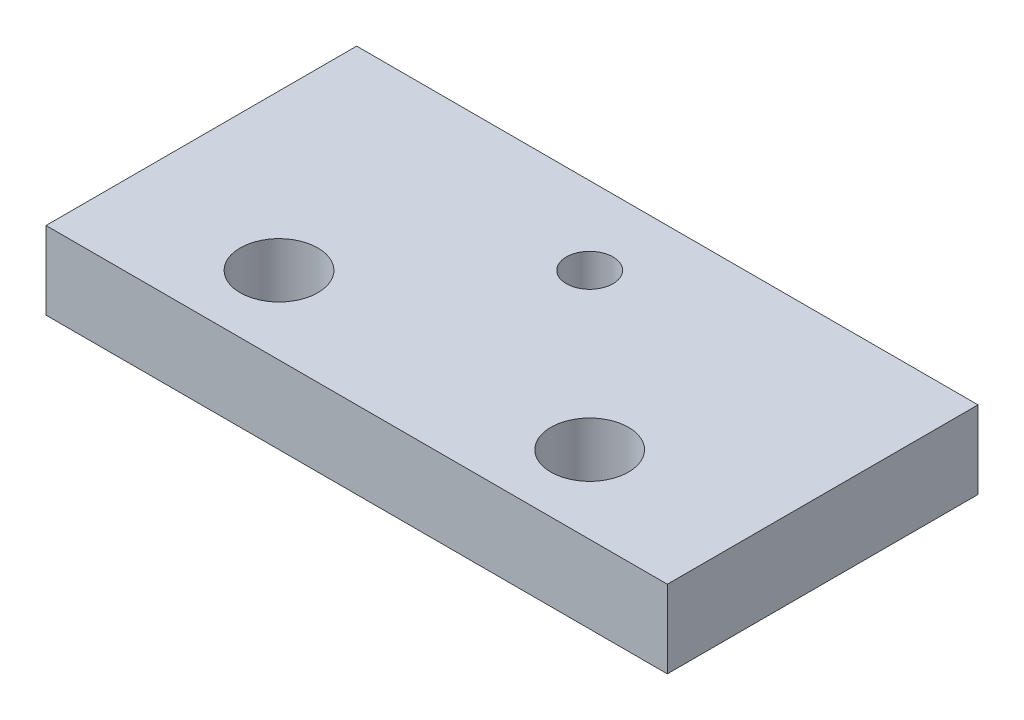
ISO-10303-21;
HEADER;
FILE_DESCRIPTION(('STEP AP214'),'2;1');
FILE_NAME('part.step','',(''),(''),'','','');
FILE_SCHEMA(('AUTOMOTIVE_DESIGN { 1 0 10303 214 1 1 1 1 }'));
ENDSEC;
DATA;
#1=APPLICATION_CONTEXT('core data for automotive mechanical design processes');
#2=APPLICATION_PROTOCOL_DEFINITION('international standard','automotive_design',2000,#1);
#3=PRODUCT_CONTEXT('',#1,'mechanical');
#4=PRODUCT('Part','Part','',(#3));
#5=PRODUCT_RELATED_PRODUCT_CATEGORY('part','',(#4));
#6=PRODUCT_DEFINITION_FORMATION('','',#4);
#7=PRODUCT_DEFINITION_CONTEXT('part definition',#1,'design');
#8=PRODUCT_DEFINITION('design','',#6,#7);
#9=PRODUCT_DEFINITION_SHAPE('','',#8);
#10=(LENGTH_UNIT() NAMED_UNIT(*) SI_UNIT(.MILLI.,.METRE.));
#11=(NAMED_UNIT(*) PLANE_ANGLE_UNIT() SI_UNIT($,.RADIAN.));
#12=(NAMED_UNIT(*) SI_UNIT($,.STERADIAN.) SOLID_ANGLE_UNIT());
#13=UNCERTAINTY_MEASURE_WITH_UNIT(LENGTH_MEASURE(1.E-05),#10,'distance_accuracy_value','');
#14=(GEOMETRIC_REPRESENTATION_CONTEXT(3) GLOBAL_UNCERTAINTY_ASSIGNED_CONTEXT((#13)) GLOBAL_UNIT_ASSIGNED_CONTEXT((#10,
#11,#12)) REPRESENTATION_CONTEXT('',''));
#15=CARTESIAN_POINT('',(0.,0.,0.));
#16=DIRECTION('',(0.,0.,1.));
#17=DIRECTION('',(1.,0.,0.));
#18=AXIS2_PLACEMENT_3D('',#15,#16,#17);
#19=CARTESIAN_POINT('',(0.,3.175,0.));
#20=DIRECTION('',(1.,0.,0.));
#21=DIRECTION('',(0.,0.,-1.));
#22=AXIS2_PLACEMENT_3D('',#19,#20,#21);
#23=PLANE('',#22);
#24=DIRECTION('',(0.,0.,1.));
#25=VECTOR('',#24,1.);
#26=CARTESIAN_POINT('',(0.,0.,0.));
#27=LINE('',#26,#25);
#28=CARTESIAN_POINT('',(0.,0.,-12.7));
#29=VERTEX_POINT('',#28);
#30=CARTESIAN_POINT('',(0.,0.,0.));
#31=VERTEX_POINT('',#30);
#32=EDGE_CURVE('E96',#29,#31,#27,.T.);
#33=ORIENTED_EDGE('',*,*,#32,.T.);
#34=DIRECTION('',(0.,-1.,0.));
#35=VECTOR('',#34,1.);
#36=CARTESIAN_POINT('',(0.,3.175,0.));
#37=LINE('',#36,#35);
#38=CARTESIAN_POINT('',(0.,3.175,0.));
#39=VERTEX_POINT('',#38);
#40=EDGE_CURVE('E11',#39,#31,#37,.T.);
#41=ORIENTED_EDGE('',*,*,#40,.F.);
#42=DIRECTION('',(0.,0.,1.));
#43=VECTOR('',#42,1.);
#44=CARTESIAN_POINT('',(0.,3.175,0.));
#45=LINE('',#44,#43);
#46=CARTESIAN_POINT('',(0.,3.175,-12.7));
#47=VERTEX_POINT('',#46);
#48=EDGE_CURVE('E84',#47,#39,#45,.T.);
#49=ORIENTED_EDGE('',*,*,#48,.F.);
#50=DIRECTION('',(0.,-1.,0.));
#51=VECTOR('',#50,1.);
#52=CARTESIAN_POINT('',(0.,3.175,-12.7));
#53=LINE('',#52,#51);
#54=EDGE_CURVE('E92',#47,#29,#53,.T.);
#55=ORIENTED_EDGE('',*,*,#54,.T.);
#56=EDGE_LOOP('',(#33,#41,#49,#55));
#57=FACE_BOUND('',#56,.T.);
#58=ADVANCED_FACE('F33',(#57),#23,.F.);
#59=CARTESIAN_POINT('',(0.,3.175,0.));
#60=DIRECTION('',(0.,0.,-1.));
#61=DIRECTION('',(-1.,0.,0.));
#62=AXIS2_PLACEMENT_3D('',#59,#60,#61);
#63=PLANE('',#62);
#64=DIRECTION('',(1.,0.,0.));
#65=VECTOR('',#64,1.);
#66=CARTESIAN_POINT('',(0.,0.,0.));
#67=LINE('',#66,#65);
#68=CARTESIAN_POINT('',(25.4,0.,0.));
#69=VERTEX_POINT('',#68);
#70=EDGE_CURVE('E88',#31,#69,#67,.T.);
#71=ORIENTED_EDGE('',*,*,#70,.T.);
#72=DIRECTION('',(0.,-1.,0.));
#73=VECTOR('',#72,1.);
#74=CARTESIAN_POINT('',(25.4,3.175,0.));
#75=LINE('',#74,#73);
#76=CARTESIAN_POINT('',(25.4,3.175,0.));
#77=VERTEX_POINT('',#76);
#78=EDGE_CURVE('E41',#77,#69,#75,.T.);
#79=ORIENTED_EDGE('',*,*,#78,.F.);
#80=DIRECTION('',(1.,0.,0.));
#81=VECTOR('',#80,1.);
#82=CARTESIAN_POINT('',(0.,3.175,0.));
#83=LINE('',#82,#81);
#84=EDGE_CURVE('E79',#39,#77,#83,.T.);
#85=ORIENTED_EDGE('',*,*,#84,.F.);
#86=ORIENTED_EDGE('',*,*,#40,.T.);
#87=EDGE_LOOP('',(#71,#79,#85,#86));
#88=FACE_BOUND('',#87,.T.);
#89=ADVANCED_FACE('F87',(#88),#63,.F.);
#90=CARTESIAN_POINT('',(25.4,3.175,0.));
#91=DIRECTION('',(-1.,0.,0.));
#92=DIRECTION('',(0.,0.,1.));
#93=AXIS2_PLACEMENT_3D('',#90,#91,#92);
#94=PLANE('',#93);
#95=DIRECTION('',(0.,0.,-1.));
#96=VECTOR('',#95,1.);
#97=CARTESIAN_POINT('',(25.4,0.,0.));
#98=LINE('',#97,#96);
#99=CARTESIAN_POINT('',(25.4,0.,-12.7));
#100=VERTEX_POINT('',#99);
#101=EDGE_CURVE('E66',#69,#100,#98,.T.);
#102=ORIENTED_EDGE('',*,*,#101,.T.);
#103=DIRECTION('',(0.,-1.,0.));
#104=VECTOR('',#103,1.);
#105=CARTESIAN_POINT('',(25.4,3.175,-12.7));
#106=LINE('',#105,#104);
#107=CARTESIAN_POINT('',(25.4,3.175,-12.7));
#108=VERTEX_POINT('',#107);
#109=EDGE_CURVE('E89',#108,#100,#106,.T.);
#110=ORIENTED_EDGE('',*,*,#109,.F.);
#111=DIRECTION('',(0.,0.,-1.));
#112=VECTOR('',#111,1.);
#113=CARTESIAN_POINT('',(25.4,3.175,0.));
#114=LINE('',#113,#112);
#115=EDGE_CURVE('E82',#77,#108,#114,.T.);
#116=ORIENTED_EDGE('',*,*,#115,.F.);
#117=ORIENTED_EDGE('',*,*,#78,.T.);
#118=EDGE_LOOP('',(#102,#110,#116,#117));
#119=FACE_BOUND('',#118,.T.);
#120=ADVANCED_FACE('F90',(#119),#94,.F.);
#121=CARTESIAN_POINT('',(0.,3.175,-12.7));
#122=DIRECTION('',(0.,0.,1.));
#123=DIRECTION('',(1.,0.,0.));
#124=AXIS2_PLACEMENT_3D('',#121,#122,#123);
#125=PLANE('',#124);
#126=DIRECTION('',(-1.,0.,0.));
#127=VECTOR('',#126,1.);
#128=CARTESIAN_POINT('',(0.,0.,-12.7));
#129=LINE('',#128,#127);
#130=EDGE_CURVE('E72',#100,#29,#129,.T.);
#131=ORIENTED_EDGE('',*,*,#130,.T.);
#132=ORIENTED_EDGE('',*,*,#54,.F.);
#133=DIRECTION('',(-1.,0.,0.));
#134=VECTOR('',#133,1.);
#135=CARTESIAN_POINT('',(0.,3.175,-12.7));
#136=LINE('',#135,#134);
#137=EDGE_CURVE('E49',#108,#47,#136,.T.);
#138=ORIENTED_EDGE('',*,*,#137,.F.);
#139=ORIENTED_EDGE('',*,*,#109,.T.);
#140=EDGE_LOOP('',(#131,#132,#138,#139));
#141=FACE_BOUND('',#140,.T.);
#142=ADVANCED_FACE('F104',(#141),#125,.F.);
#143=CARTESIAN_POINT('',(0.,3.175,0.));
#144=DIRECTION('',(0.,-1.,0.));
#145=DIRECTION('',(0.,0.,-1.));
#146=AXIS2_PLACEMENT_3D('',#143,#144,#145);
#147=PLANE('',#146);
#148=CARTESIAN_POINT('',(12.7,3.175,-9.525));
#149=DIRECTION('',(0.,1.,0.));
#150=DIRECTION('',(0.,0.,1.));
#151=AXIS2_PLACEMENT_3D('',#148,#149,#150);
#152=CIRCLE('',#151,0.9525);
#153=CARTESIAN_POINT('',(12.7,3.175,-8.5725));
#154=VERTEX_POINT('',#153);
#155=EDGE_CURVE('E122',#154,#154,#152,.T.);
#156=ORIENTED_EDGE('',*,*,#155,.F.);
#157=EDGE_LOOP('',(#156));
#158=FACE_BOUND('',#157,.T.);
#159=CARTESIAN_POINT('',(6.35,3.175,-3.175));
#160=DIRECTION('',(0.,1.,0.));
#161=DIRECTION('',(0.,0.,-1.));
#162=AXIS2_PLACEMENT_3D('',#159,#160,#161);
#163=CIRCLE('',#162,1.5875);
#164=CARTESIAN_POINT('',(6.35,3.175,-4.7625));
#165=VERTEX_POINT('',#164);
#166=EDGE_CURVE('E116',#165,#165,#163,.T.);
#167=ORIENTED_EDGE('',*,*,#166,.F.);
#168=EDGE_LOOP('',(#167));
#169=FACE_BOUND('',#168,.T.);
#170=CARTESIAN_POINT('',(19.05,3.175,-3.175));
#171=DIRECTION('',(0.,1.,0.));
#172=DIRECTION('',(0.,0.,1.));
#173=AXIS2_PLACEMENT_3D('',#170,#171,#172);
#174=CIRCLE('',#173,1.5875);
#175=CARTESIAN_POINT('',(19.05,3.175,-1.5875));
#176=VERTEX_POINT('',#175);
#177=EDGE_CURVE('E110',#176,#176,#174,.T.);
#178=ORIENTED_EDGE('',*,*,#177,.F.);
#179=EDGE_LOOP('',(#178));
#180=FACE_BOUND('',#179,.T.);
#181=ORIENTED_EDGE('',*,*,#48,.T.);
#182=ORIENTED_EDGE('',*,*,#84,.T.);
#183=ORIENTED_EDGE('',*,*,#115,.T.);
#184=ORIENTED_EDGE('',*,*,#137,.T.);
#185=EDGE_LOOP('',(#181,#182,#183,#184));
#186=FACE_BOUND('',#185,.T.);
#187=ADVANCED_FACE('F80',(#158,#169,#180,#186),#147,.F.);
#188=CARTESIAN_POINT('',(0.,0.,0.));
#189=DIRECTION('',(0.,-1.,0.));
#190=DIRECTION('',(0.,0.,-1.));
#191=AXIS2_PLACEMENT_3D('',#188,#189,#190);
#192=PLANE('',#191);
#193=CARTESIAN_POINT('',(12.7,0.,-9.525));
#194=DIRECTION('',(0.,1.,0.));
#195=DIRECTION('',(0.,0.,1.));
#196=AXIS2_PLACEMENT_3D('',#193,#194,#195);
#197=CIRCLE('',#196,0.9525);
#198=CARTESIAN_POINT('',(12.7,0.,-8.5725));
#199=VERTEX_POINT('',#198);
#200=EDGE_CURVE('E119',#199,#199,#197,.T.);
#201=ORIENTED_EDGE('',*,*,#200,.T.);
#202=EDGE_LOOP('',(#201));
#203=FACE_BOUND('',#202,.T.);
#204=CARTESIAN_POINT('',(6.35,0.,-3.175));
#205=DIRECTION('',(0.,1.,0.));
#206=DIRECTION('',(0.,0.,-1.));
#207=AXIS2_PLACEMENT_3D('',#204,#205,#206);
#208=CIRCLE('',#207,1.5875);
#209=CARTESIAN_POINT('',(6.35,0.,-4.7625));
#210=VERTEX_POINT('',#209);
#211=EDGE_CURVE('E113',#210,#210,#208,.T.);
#212=ORIENTED_EDGE('',*,*,#211,.T.);
#213=EDGE_LOOP('',(#212));
#214=FACE_BOUND('',#213,.T.);
#215=CARTESIAN_POINT('',(19.05,0.,-3.175));
#216=DIRECTION('',(0.,1.,0.));
#217=DIRECTION('',(0.,0.,1.));
#218=AXIS2_PLACEMENT_3D('',#215,#216,#217);
#219=CIRCLE('',#218,1.5875);
#220=CARTESIAN_POINT('',(19.05,0.,-1.5875));
#221=VERTEX_POINT('',#220);
#222=EDGE_CURVE('E99',#221,#221,#219,.T.);
#223=ORIENTED_EDGE('',*,*,#222,.T.);
#224=EDGE_LOOP('',(#223));
#225=FACE_BOUND('',#224,.T.);
#226=ORIENTED_EDGE('',*,*,#32,.F.);
#227=ORIENTED_EDGE('',*,*,#130,.F.);
#228=ORIENTED_EDGE('',*,*,#101,.F.);
#229=ORIENTED_EDGE('',*,*,#70,.F.);
#230=EDGE_LOOP('',(#226,#227,#228,#229));
#231=FACE_BOUND('',#230,.T.);
#232=ADVANCED_FACE('F107',(#203,#214,#225,#231),#192,.T.);
#233=CARTESIAN_POINT('',(19.05,0.,-3.175));
#234=DIRECTION('',(0.,1.,0.));
#235=DIRECTION('',(0.,0.,1.));
#236=AXIS2_PLACEMENT_3D('',#233,#234,#235);
#237=CYLINDRICAL_SURFACE('',#236,1.5875);
#238=ORIENTED_EDGE('',*,*,#222,.F.);
#239=EDGE_LOOP('',(#238));
#240=FACE_BOUND('',#239,.T.);
#241=ORIENTED_EDGE('',*,*,#177,.T.);
#242=EDGE_LOOP('',(#241));
#243=FACE_BOUND('',#242,.T.);
#244=ADVANCED_FACE('F144',(#240,#243),#237,.F.);
#245=CARTESIAN_POINT('',(6.35,0.,-3.175));
#246=DIRECTION('',(0.,1.,0.));
#247=DIRECTION('',(0.,0.,1.));
#248=AXIS2_PLACEMENT_3D('',#245,#246,#247);
#249=CYLINDRICAL_SURFACE('',#248,1.5875);
#250=ORIENTED_EDGE('',*,*,#211,.F.);
#251=EDGE_LOOP('',(#250));
#252=FACE_BOUND('',#251,.T.);
#253=ORIENTED_EDGE('',*,*,#166,.T.);
#254=EDGE_LOOP('',(#253));
#255=FACE_BOUND('',#254,.T.);
#256=ADVANCED_FACE('F133',(#252,#255),#249,.F.);
#257=CARTESIAN_POINT('',(12.7,0.,-9.525));
#258=DIRECTION('',(0.,1.,0.));
#259=DIRECTION('',(0.,0.,1.));
#260=AXIS2_PLACEMENT_3D('',#257,#258,#259);
#261=CYLINDRICAL_SURFACE('',#260,0.9525);
#262=ORIENTED_EDGE('',*,*,#200,.F.);
#263=EDGE_LOOP('',(#262));
#264=FACE_BOUND('',#263,.T.);
#265=ORIENTED_EDGE('',*,*,#155,.T.);
#266=EDGE_LOOP('',(#265));
#267=FACE_BOUND('',#266,.T.);
#268=ADVANCED_FACE('F130',(#264,#267),#261,.F.);
#269=CLOSED_SHELL('',(#58,#89,#120,#142,#187,#232,#244,#256,#268));
#270=MANIFOLD_SOLID_BREP('B2',#269);
#271=ADVANCED_BREP_SHAPE_REPRESENTATION('',(#18,#270),#14);
#272=SHAPE_DEFINITION_REPRESENTATION(#9,#271);
ENDSEC;
END-ISO-10303-21;
